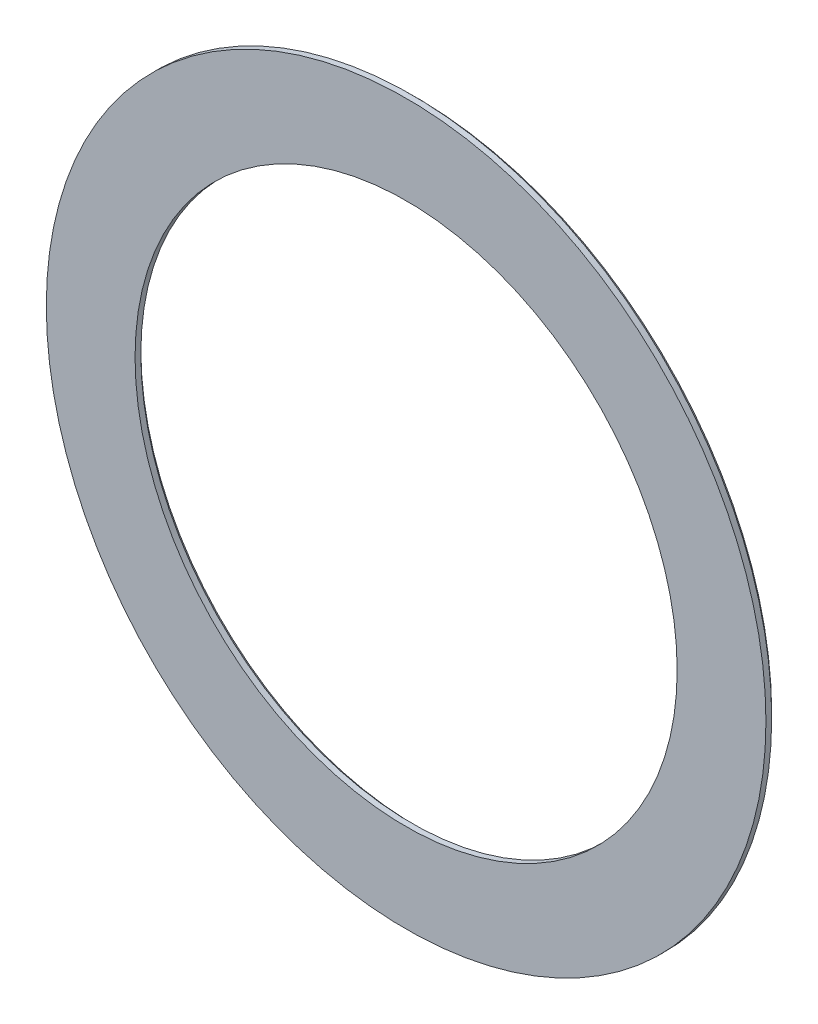
ISO-10303-21;
HEADER;
FILE_DESCRIPTION(('STEP AP214'),'2;1');
FILE_NAME('part.step','',(''),(''),'','','');
FILE_SCHEMA(('AUTOMOTIVE_DESIGN { 1 0 10303 214 1 1 1 1 }'));
ENDSEC;
DATA;
#1=APPLICATION_CONTEXT('core data for automotive mechanical design processes');
#2=APPLICATION_PROTOCOL_DEFINITION('international standard','automotive_design',2000,#1);
#3=PRODUCT_CONTEXT('',#1,'mechanical');
#4=PRODUCT('Part','Part','',(#3));
#5=PRODUCT_RELATED_PRODUCT_CATEGORY('part','',(#4));
#6=PRODUCT_DEFINITION_FORMATION('','',#4);
#7=PRODUCT_DEFINITION_CONTEXT('part definition',#1,'design');
#8=PRODUCT_DEFINITION('design','',#6,#7);
#9=PRODUCT_DEFINITION_SHAPE('','',#8);
#10=(LENGTH_UNIT() NAMED_UNIT(*) SI_UNIT(.MILLI.,.METRE.));
#11=(NAMED_UNIT(*) PLANE_ANGLE_UNIT() SI_UNIT($,.RADIAN.));
#12=(NAMED_UNIT(*) SI_UNIT($,.STERADIAN.) SOLID_ANGLE_UNIT());
#13=UNCERTAINTY_MEASURE_WITH_UNIT(LENGTH_MEASURE(1.E-05),#10,'distance_accuracy_value','');
#14=(GEOMETRIC_REPRESENTATION_CONTEXT(3) GLOBAL_UNCERTAINTY_ASSIGNED_CONTEXT((#13)) GLOBAL_UNIT_ASSIGNED_CONTEXT((#10,
#11,#12)) REPRESENTATION_CONTEXT('',''));
#15=CARTESIAN_POINT('',(0.,0.,0.));
#16=DIRECTION('',(0.,0.,1.));
#17=DIRECTION('',(1.,0.,0.));
#18=AXIS2_PLACEMENT_3D('',#15,#16,#17);
#19=CARTESIAN_POINT('',(0.,0.,0.75));
#20=DIRECTION('',(0.,0.,1.));
#21=DIRECTION('',(1.,0.,0.));
#22=AXIS2_PLACEMENT_3D('',#19,#20,#21);
#23=PLANE('',#22);
#24=CARTESIAN_POINT('',(0.,0.,0.75));
#25=DIRECTION('',(0.,0.,1.));
#26=DIRECTION('',(1.,0.,0.));
#27=AXIS2_PLACEMENT_3D('',#24,#25,#26);
#28=CIRCLE('',#27,28.075);
#29=CARTESIAN_POINT('',(28.075,0.,0.75));
#30=VERTEX_POINT('',#29);
#31=EDGE_CURVE('E62',#30,#30,#28,.T.);
#32=ORIENTED_EDGE('',*,*,#31,.T.);
#33=EDGE_LOOP('',(#32));
#34=FACE_BOUND('',#33,.T.);
#35=CARTESIAN_POINT('',(0.,0.,0.75));
#36=DIRECTION('',(0.,0.,1.));
#37=DIRECTION('',(1.,0.,0.));
#38=AXIS2_PLACEMENT_3D('',#35,#36,#37);
#39=CIRCLE('',#38,21.15);
#40=CARTESIAN_POINT('',(21.15,0.,0.75));
#41=VERTEX_POINT('',#40);
#42=EDGE_CURVE('E65',#41,#41,#39,.T.);
#43=ORIENTED_EDGE('',*,*,#42,.F.);
#44=EDGE_LOOP('',(#43));
#45=FACE_BOUND('',#44,.T.);
#46=ADVANCED_FACE('F41',(#34,#45),#23,.T.);
#47=CARTESIAN_POINT('',(0.,0.,0.));
#48=DIRECTION('',(0.,0.,1.));
#49=DIRECTION('',(1.,0.,0.));
#50=AXIS2_PLACEMENT_3D('',#47,#48,#49);
#51=PLANE('',#50);
#52=CARTESIAN_POINT('',(0.,0.,0.));
#53=DIRECTION('',(0.,0.,1.));
#54=DIRECTION('',(1.,0.,0.));
#55=AXIS2_PLACEMENT_3D('',#52,#53,#54);
#56=CIRCLE('',#55,21.45);
#57=CARTESIAN_POINT('',(21.45,0.,0.));
#58=VERTEX_POINT('',#57);
#59=EDGE_CURVE('E53',#58,#58,#56,.T.);
#60=ORIENTED_EDGE('',*,*,#59,.T.);
#61=EDGE_LOOP('',(#60));
#62=FACE_BOUND('',#61,.T.);
#63=CARTESIAN_POINT('',(0.,0.,0.));
#64=DIRECTION('',(0.,0.,1.));
#65=DIRECTION('',(1.,0.,0.));
#66=AXIS2_PLACEMENT_3D('',#63,#64,#65);
#67=CIRCLE('',#66,27.775);
#68=CARTESIAN_POINT('',(27.775,0.,0.));
#69=VERTEX_POINT('',#68);
#70=EDGE_CURVE('E57',#69,#69,#67,.F.);
#71=ORIENTED_EDGE('',*,*,#70,.T.);
#72=EDGE_LOOP('',(#71));
#73=FACE_BOUND('',#72,.T.);
#74=ADVANCED_FACE('F72',(#62,#73),#51,.F.);
#75=CARTESIAN_POINT('',(0.,0.,0.75));
#76=DIRECTION('',(0.,0.,-1.));
#77=DIRECTION('',(-1.,0.,0.));
#78=AXIS2_PLACEMENT_3D('',#75,#76,#77);
#79=CYLINDRICAL_SURFACE('',#78,28.075);
#80=CARTESIAN_POINT('',(0.,0.,0.299999999999998));
#81=DIRECTION('',(0.,0.,1.));
#82=DIRECTION('',(1.,0.,0.));
#83=AXIS2_PLACEMENT_3D('',#80,#81,#82);
#84=CIRCLE('',#83,28.075);
#85=CARTESIAN_POINT('',(28.075,0.,0.299999999999998));
#86=VERTEX_POINT('',#85);
#87=EDGE_CURVE('E10',#86,#86,#84,.T.);
#88=ORIENTED_EDGE('',*,*,#87,.T.);
#89=EDGE_LOOP('',(#88));
#90=FACE_BOUND('',#89,.T.);
#91=ORIENTED_EDGE('',*,*,#31,.F.);
#92=EDGE_LOOP('',(#91));
#93=FACE_BOUND('',#92,.T.);
#94=ADVANCED_FACE('F78',(#90,#93),#79,.T.);
#95=CARTESIAN_POINT('',(0.,0.,0.75));
#96=DIRECTION('',(0.,0.,-1.));
#97=DIRECTION('',(-1.,0.,0.));
#98=AXIS2_PLACEMENT_3D('',#95,#96,#97);
#99=CYLINDRICAL_SURFACE('',#98,21.15);
#100=CARTESIAN_POINT('',(0.,0.,0.299999999999995));
#101=DIRECTION('',(0.,0.,1.));
#102=DIRECTION('',(1.,0.,0.));
#103=AXIS2_PLACEMENT_3D('',#100,#101,#102);
#104=CIRCLE('',#103,21.15);
#105=CARTESIAN_POINT('',(21.15,0.,0.299999999999995));
#106=VERTEX_POINT('',#105);
#107=EDGE_CURVE('E49',#106,#106,#104,.F.);
#108=ORIENTED_EDGE('',*,*,#107,.T.);
#109=EDGE_LOOP('',(#108));
#110=FACE_BOUND('',#109,.T.);
#111=ORIENTED_EDGE('',*,*,#42,.T.);
#112=EDGE_LOOP('',(#111));
#113=FACE_BOUND('',#112,.T.);
#114=ADVANCED_FACE('F69',(#110,#113),#99,.F.);
#115=CARTESIAN_POINT('',(0.,0.,0.));
#116=DIRECTION('',(0.,0.,-1.));
#117=DIRECTION('',(-1.,0.,0.));
#118=AXIS2_PLACEMENT_3D('',#115,#116,#117);
#119=CONICAL_SURFACE('',#118,21.45,0.785398163397443);
#120=ORIENTED_EDGE('',*,*,#107,.F.);
#121=EDGE_LOOP('',(#120));
#122=FACE_BOUND('',#121,.T.);
#123=ORIENTED_EDGE('',*,*,#59,.F.);
#124=EDGE_LOOP('',(#123));
#125=FACE_BOUND('',#124,.T.);
#126=ADVANCED_FACE('F85',(#122,#125),#119,.F.);
#127=CARTESIAN_POINT('',(0.,0.,0.299999999999998));
#128=DIRECTION('',(0.,0.,1.));
#129=DIRECTION('',(1.,0.,0.));
#130=AXIS2_PLACEMENT_3D('',#127,#128,#129);
#131=CONICAL_SURFACE('',#130,28.075,0.785398163397443);
#132=ORIENTED_EDGE('',*,*,#70,.F.);
#133=EDGE_LOOP('',(#132));
#134=FACE_BOUND('',#133,.T.);
#135=ORIENTED_EDGE('',*,*,#87,.F.);
#136=EDGE_LOOP('',(#135));
#137=FACE_BOUND('',#136,.T.);
#138=ADVANCED_FACE('F44',(#134,#137),#131,.T.);
#139=CLOSED_SHELL('',(#46,#74,#94,#114,#126,#138));
#140=MANIFOLD_SOLID_BREP('B2',#139);
#141=ADVANCED_BREP_SHAPE_REPRESENTATION('',(#18,#140),#14);
#142=SHAPE_DEFINITION_REPRESENTATION(#9,#141);
ENDSEC;
END-ISO-10303-21;
